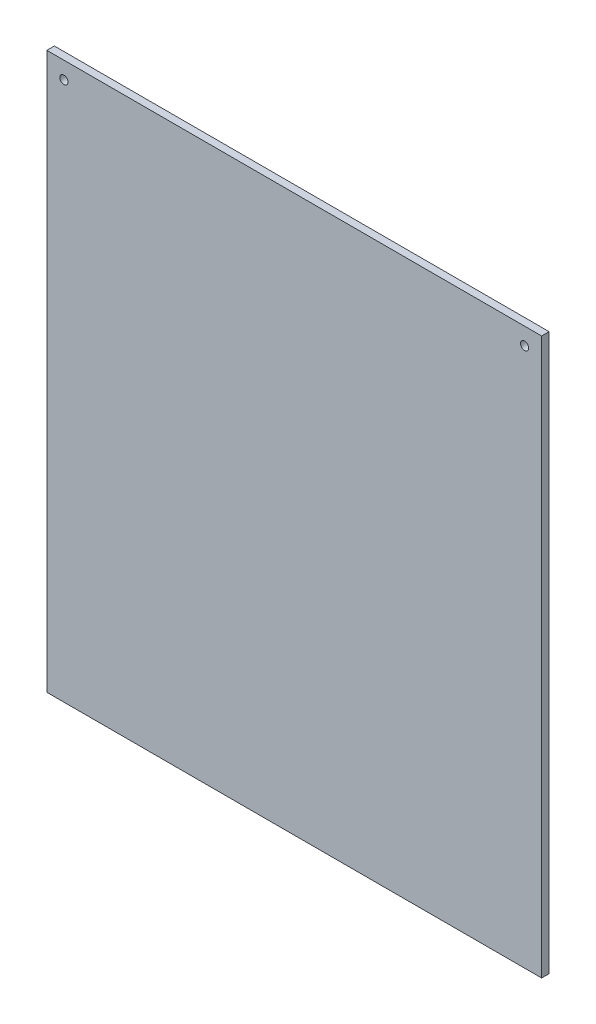
ISO-10303-21;
HEADER;
FILE_DESCRIPTION(('STEP AP214'),'2;1');
FILE_NAME('part.step','',(''),(''),'','','');
FILE_SCHEMA(('AUTOMOTIVE_DESIGN { 1 0 10303 214 1 1 1 1 }'));
ENDSEC;
DATA;
#1=APPLICATION_CONTEXT('core data for automotive mechanical design processes');
#2=APPLICATION_PROTOCOL_DEFINITION('international standard','automotive_design',2000,#1);
#3=PRODUCT_CONTEXT('',#1,'mechanical');
#4=PRODUCT('Part','Part','',(#3));
#5=PRODUCT_RELATED_PRODUCT_CATEGORY('part','',(#4));
#6=PRODUCT_DEFINITION_FORMATION('','',#4);
#7=PRODUCT_DEFINITION_CONTEXT('part definition',#1,'design');
#8=PRODUCT_DEFINITION('design','',#6,#7);
#9=PRODUCT_DEFINITION_SHAPE('','',#8);
#10=(LENGTH_UNIT() NAMED_UNIT(*) SI_UNIT(.MILLI.,.METRE.));
#11=(NAMED_UNIT(*) PLANE_ANGLE_UNIT() SI_UNIT($,.RADIAN.));
#12=(NAMED_UNIT(*) SI_UNIT($,.STERADIAN.) SOLID_ANGLE_UNIT());
#13=UNCERTAINTY_MEASURE_WITH_UNIT(LENGTH_MEASURE(1.E-05),#10,'distance_accuracy_value','');
#14=(GEOMETRIC_REPRESENTATION_CONTEXT(3) GLOBAL_UNCERTAINTY_ASSIGNED_CONTEXT((#13)) GLOBAL_UNIT_ASSIGNED_CONTEXT((#10,
#11,#12)) REPRESENTATION_CONTEXT('',''));
#15=CARTESIAN_POINT('',(0.,0.,0.));
#16=DIRECTION('',(0.,0.,1.));
#17=DIRECTION('',(1.,0.,0.));
#18=AXIS2_PLACEMENT_3D('',#15,#16,#17);
#19=CARTESIAN_POINT('',(0.,0.,3.302));
#20=DIRECTION('',(0.,0.,1.));
#21=DIRECTION('',(1.,0.,0.));
#22=AXIS2_PLACEMENT_3D('',#19,#20,#21);
#23=PLANE('',#22);
#24=CARTESIAN_POINT('',(-128.615183246073,117.38219895288,3.302));
#25=DIRECTION('',(0.,0.,1.));
#26=DIRECTION('',(1.,0.,0.));
#27=AXIS2_PLACEMENT_3D('',#24,#25,#26);
#28=CIRCLE('',#27,1.80000000000001);
#29=CARTESIAN_POINT('',(-130.415183246073,117.38219895288,3.302));
#30=VERTEX_POINT('',#29);
#31=EDGE_CURVE('E100',#30,#30,#28,.T.);
#32=ORIENTED_EDGE('',*,*,#31,.F.);
#33=EDGE_LOOP('',(#32));
#34=FACE_BOUND('',#33,.T.);
#35=DIRECTION('',(-1.,0.,0.));
#36=VECTOR('',#35,1.);
#37=CARTESIAN_POINT('',(81.8848167539267,124.88219895288,3.302));
#38=LINE('',#37,#36);
#39=CARTESIAN_POINT('',(81.8848167539267,124.88219895288,3.302));
#40=VERTEX_POINT('',#39);
#41=CARTESIAN_POINT('',(-136.115183246073,124.88219895288,3.302));
#42=VERTEX_POINT('',#41);
#43=EDGE_CURVE('E85',#40,#42,#38,.T.);
#44=ORIENTED_EDGE('',*,*,#43,.T.);
#45=DIRECTION('',(0.,-1.,0.));
#46=VECTOR('',#45,1.);
#47=CARTESIAN_POINT('',(-136.115183246073,124.88219895288,3.302));
#48=LINE('',#47,#46);
#49=CARTESIAN_POINT('',(-136.115183246073,-120.11780104712,3.302));
#50=VERTEX_POINT('',#49);
#51=EDGE_CURVE('E80',#42,#50,#48,.T.);
#52=ORIENTED_EDGE('',*,*,#51,.T.);
#53=DIRECTION('',(1.,0.,0.));
#54=VECTOR('',#53,1.);
#55=CARTESIAN_POINT('',(81.8848167539267,-120.11780104712,3.302));
#56=LINE('',#55,#54);
#57=CARTESIAN_POINT('',(81.8848167539267,-120.11780104712,3.302));
#58=VERTEX_POINT('',#57);
#59=EDGE_CURVE('E83',#50,#58,#56,.T.);
#60=ORIENTED_EDGE('',*,*,#59,.T.);
#61=DIRECTION('',(0.,1.,0.));
#62=VECTOR('',#61,1.);
#63=CARTESIAN_POINT('',(81.8848167539267,124.88219895288,3.302));
#64=LINE('',#63,#62);
#65=EDGE_CURVE('E50',#58,#40,#64,.T.);
#66=ORIENTED_EDGE('',*,*,#65,.T.);
#67=EDGE_LOOP('',(#44,#52,#60,#66));
#68=FACE_BOUND('',#67,.T.);
#69=CARTESIAN_POINT('',(74.3848167539267,117.38219895288,3.302));
#70=DIRECTION('',(0.,0.,1.));
#71=DIRECTION('',(1.,0.,0.));
#72=AXIS2_PLACEMENT_3D('',#69,#70,#71);
#73=CIRCLE('',#72,1.79999999999999);
#74=CARTESIAN_POINT('',(72.5848167539267,117.38219895288,3.302));
#75=VERTEX_POINT('',#74);
#76=EDGE_CURVE('E115',#75,#75,#73,.T.);
#77=ORIENTED_EDGE('',*,*,#76,.F.);
#78=EDGE_LOOP('',(#77));
#79=FACE_BOUND('',#78,.T.);
#80=ADVANCED_FACE('F33',(#34,#68,#79),#23,.T.);
#81=CARTESIAN_POINT('',(0.,0.,0.));
#82=DIRECTION('',(0.,0.,1.));
#83=DIRECTION('',(1.,0.,0.));
#84=AXIS2_PLACEMENT_3D('',#81,#82,#83);
#85=PLANE('',#84);
#86=DIRECTION('',(-1.,0.,0.));
#87=VECTOR('',#86,1.);
#88=CARTESIAN_POINT('',(81.8848167539267,124.88219895288,0.));
#89=LINE('',#88,#87);
#90=CARTESIAN_POINT('',(81.8848167539267,124.88219895288,0.));
#91=VERTEX_POINT('',#90);
#92=CARTESIAN_POINT('',(-136.115183246073,124.88219895288,0.));
#93=VERTEX_POINT('',#92);
#94=EDGE_CURVE('E97',#91,#93,#89,.T.);
#95=ORIENTED_EDGE('',*,*,#94,.F.);
#96=DIRECTION('',(0.,1.,0.));
#97=VECTOR('',#96,1.);
#98=CARTESIAN_POINT('',(81.8848167539267,124.88219895288,0.));
#99=LINE('',#98,#97);
#100=CARTESIAN_POINT('',(81.8848167539267,-120.11780104712,0.));
#101=VERTEX_POINT('',#100);
#102=EDGE_CURVE('E73',#101,#91,#99,.T.);
#103=ORIENTED_EDGE('',*,*,#102,.F.);
#104=DIRECTION('',(1.,0.,0.));
#105=VECTOR('',#104,1.);
#106=CARTESIAN_POINT('',(81.8848167539267,-120.11780104712,0.));
#107=LINE('',#106,#105);
#108=CARTESIAN_POINT('',(-136.115183246073,-120.11780104712,0.));
#109=VERTEX_POINT('',#108);
#110=EDGE_CURVE('E67',#109,#101,#107,.T.);
#111=ORIENTED_EDGE('',*,*,#110,.F.);
#112=DIRECTION('',(0.,-1.,0.));
#113=VECTOR('',#112,1.);
#114=CARTESIAN_POINT('',(-136.115183246073,124.88219895288,0.));
#115=LINE('',#114,#113);
#116=EDGE_CURVE('E89',#93,#109,#115,.T.);
#117=ORIENTED_EDGE('',*,*,#116,.F.);
#118=EDGE_LOOP('',(#95,#103,#111,#117));
#119=FACE_BOUND('',#118,.T.);
#120=CARTESIAN_POINT('',(-128.615183246073,117.38219895288,0.));
#121=DIRECTION('',(0.,0.,1.));
#122=DIRECTION('',(1.,0.,0.));
#123=AXIS2_PLACEMENT_3D('',#120,#121,#122);
#124=CIRCLE('',#123,1.80000000000001);
#125=CARTESIAN_POINT('',(-130.415183246073,117.38219895288,0.));
#126=VERTEX_POINT('',#125);
#127=EDGE_CURVE('E112',#126,#126,#124,.T.);
#128=ORIENTED_EDGE('',*,*,#127,.T.);
#129=EDGE_LOOP('',(#128));
#130=FACE_BOUND('',#129,.T.);
#131=CARTESIAN_POINT('',(74.3848167539267,117.38219895288,0.));
#132=DIRECTION('',(0.,0.,1.));
#133=DIRECTION('',(1.,0.,0.));
#134=AXIS2_PLACEMENT_3D('',#131,#132,#133);
#135=CIRCLE('',#134,1.79999999999999);
#136=CARTESIAN_POINT('',(72.5848167539267,117.38219895288,0.));
#137=VERTEX_POINT('',#136);
#138=EDGE_CURVE('E118',#137,#137,#135,.T.);
#139=ORIENTED_EDGE('',*,*,#138,.T.);
#140=EDGE_LOOP('',(#139));
#141=FACE_BOUND('',#140,.T.);
#142=ADVANCED_FACE('F108',(#119,#130,#141),#85,.F.);
#143=CARTESIAN_POINT('',(81.8848167539267,124.88219895288,3.302));
#144=DIRECTION('',(0.,-1.,0.));
#145=DIRECTION('',(1.,0.,0.));
#146=AXIS2_PLACEMENT_3D('',#143,#144,#145);
#147=PLANE('',#146);
#148=ORIENTED_EDGE('',*,*,#94,.T.);
#149=DIRECTION('',(0.,0.,-1.));
#150=VECTOR('',#149,1.);
#151=CARTESIAN_POINT('',(-136.115183246073,124.88219895288,3.302));
#152=LINE('',#151,#150);
#153=EDGE_CURVE('E11',#42,#93,#152,.T.);
#154=ORIENTED_EDGE('',*,*,#153,.F.);
#155=ORIENTED_EDGE('',*,*,#43,.F.);
#156=DIRECTION('',(0.,0.,-1.));
#157=VECTOR('',#156,1.);
#158=CARTESIAN_POINT('',(81.8848167539267,124.88219895288,3.302));
#159=LINE('',#158,#157);
#160=EDGE_CURVE('E93',#40,#91,#159,.T.);
#161=ORIENTED_EDGE('',*,*,#160,.T.);
#162=EDGE_LOOP('',(#148,#154,#155,#161));
#163=FACE_BOUND('',#162,.T.);
#164=ADVANCED_FACE('F35',(#163),#147,.F.);
#165=CARTESIAN_POINT('',(-136.115183246073,124.88219895288,3.302));
#166=DIRECTION('',(1.,0.,0.));
#167=DIRECTION('',(0.,1.,0.));
#168=AXIS2_PLACEMENT_3D('',#165,#166,#167);
#169=PLANE('',#168);
#170=ORIENTED_EDGE('',*,*,#116,.T.);
#171=DIRECTION('',(0.,0.,-1.));
#172=VECTOR('',#171,1.);
#173=CARTESIAN_POINT('',(-136.115183246073,-120.11780104712,3.302));
#174=LINE('',#173,#172);
#175=EDGE_CURVE('E42',#50,#109,#174,.T.);
#176=ORIENTED_EDGE('',*,*,#175,.F.);
#177=ORIENTED_EDGE('',*,*,#51,.F.);
#178=ORIENTED_EDGE('',*,*,#153,.T.);
#179=EDGE_LOOP('',(#170,#176,#177,#178));
#180=FACE_BOUND('',#179,.T.);
#181=ADVANCED_FACE('F88',(#180),#169,.F.);
#182=CARTESIAN_POINT('',(81.8848167539267,-120.11780104712,3.302));
#183=DIRECTION('',(0.,1.,0.));
#184=DIRECTION('',(-1.,0.,0.));
#185=AXIS2_PLACEMENT_3D('',#182,#183,#184);
#186=PLANE('',#185);
#187=ORIENTED_EDGE('',*,*,#110,.T.);
#188=DIRECTION('',(0.,0.,-1.));
#189=VECTOR('',#188,1.);
#190=CARTESIAN_POINT('',(81.8848167539267,-120.11780104712,3.302));
#191=LINE('',#190,#189);
#192=EDGE_CURVE('E90',#58,#101,#191,.T.);
#193=ORIENTED_EDGE('',*,*,#192,.F.);
#194=ORIENTED_EDGE('',*,*,#59,.F.);
#195=ORIENTED_EDGE('',*,*,#175,.T.);
#196=EDGE_LOOP('',(#187,#193,#194,#195));
#197=FACE_BOUND('',#196,.T.);
#198=ADVANCED_FACE('F91',(#197),#186,.F.);
#199=CARTESIAN_POINT('',(81.8848167539267,124.88219895288,3.302));
#200=DIRECTION('',(-1.,0.,0.));
#201=DIRECTION('',(0.,-1.,0.));
#202=AXIS2_PLACEMENT_3D('',#199,#200,#201);
#203=PLANE('',#202);
#204=ORIENTED_EDGE('',*,*,#102,.T.);
#205=ORIENTED_EDGE('',*,*,#160,.F.);
#206=ORIENTED_EDGE('',*,*,#65,.F.);
#207=ORIENTED_EDGE('',*,*,#192,.T.);
#208=EDGE_LOOP('',(#204,#205,#206,#207));
#209=FACE_BOUND('',#208,.T.);
#210=ADVANCED_FACE('F105',(#209),#203,.F.);
#211=CARTESIAN_POINT('',(-128.615183246073,117.38219895288,3.302));
#212=DIRECTION('',(0.,0.,-1.));
#213=DIRECTION('',(-1.,0.,0.));
#214=AXIS2_PLACEMENT_3D('',#211,#212,#213);
#215=CYLINDRICAL_SURFACE('',#214,1.80000000000001);
#216=CARTESIAN_POINT('',(-130.415183246073,117.38219895288,3.302));
#217=CARTESIAN_POINT('',(-130.415183246073,117.38219895288,3.26760416666667));
#218=CARTESIAN_POINT('',(-130.415183246073,117.38219895288,3.23320833333333));
#219=CARTESIAN_POINT('',(-130.415183246073,117.38219895288,3.16441666666667));
#220=CARTESIAN_POINT('',(-130.415183246073,117.38219895288,3.13002083333333));
#221=CARTESIAN_POINT('',(-130.415183246073,117.38219895288,3.06122916666667));
#222=CARTESIAN_POINT('',(-130.415183246073,117.38219895288,3.02683333333333));
#223=CARTESIAN_POINT('',(-130.415183246073,117.38219895288,2.95804166666667));
#224=CARTESIAN_POINT('',(-130.415183246073,117.38219895288,2.92364583333333));
#225=CARTESIAN_POINT('',(-130.415183246073,117.38219895288,2.85485416666667));
#226=CARTESIAN_POINT('',(-130.415183246073,117.38219895288,2.82045833333333));
#227=CARTESIAN_POINT('',(-130.415183246073,117.38219895288,2.75166666666667));
#228=CARTESIAN_POINT('',(-130.415183246073,117.38219895288,2.71727083333333));
#229=CARTESIAN_POINT('',(-130.415183246073,117.38219895288,2.64847916666667));
#230=CARTESIAN_POINT('',(-130.415183246073,117.38219895288,2.61408333333333));
#231=CARTESIAN_POINT('',(-130.415183246073,117.38219895288,2.54529166666667));
#232=CARTESIAN_POINT('',(-130.415183246073,117.38219895288,2.51089583333333));
#233=CARTESIAN_POINT('',(-130.415183246073,117.38219895288,2.44210416666667));
#234=CARTESIAN_POINT('',(-130.415183246073,117.38219895288,2.40770833333333));
#235=CARTESIAN_POINT('',(-130.415183246073,117.38219895288,2.33891666666667));
#236=CARTESIAN_POINT('',(-130.415183246073,117.38219895288,2.30452083333333));
#237=CARTESIAN_POINT('',(-130.415183246073,117.38219895288,2.23572916666667));
#238=CARTESIAN_POINT('',(-130.415183246073,117.38219895288,2.20133333333333));
#239=CARTESIAN_POINT('',(-130.415183246073,117.38219895288,2.13254166666667));
#240=CARTESIAN_POINT('',(-130.415183246073,117.38219895288,2.09814583333333));
#241=CARTESIAN_POINT('',(-130.415183246073,117.38219895288,2.02935416666667));
#242=CARTESIAN_POINT('',(-130.415183246073,117.38219895288,1.99495833333333));
#243=CARTESIAN_POINT('',(-130.415183246073,117.38219895288,1.92616666666667));
#244=CARTESIAN_POINT('',(-130.415183246073,117.38219895288,1.89177083333333));
#245=CARTESIAN_POINT('',(-130.415183246073,117.38219895288,1.82297916666667));
#246=CARTESIAN_POINT('',(-130.415183246073,117.38219895288,1.78858333333333));
#247=CARTESIAN_POINT('',(-130.415183246073,117.38219895288,1.71979166666667));
#248=CARTESIAN_POINT('',(-130.415183246073,117.38219895288,1.68539583333333));
#249=CARTESIAN_POINT('',(-130.415183246073,117.38219895288,1.61660416666667));
#250=CARTESIAN_POINT('',(-130.415183246073,117.38219895288,1.58220833333333));
#251=CARTESIAN_POINT('',(-130.415183246073,117.38219895288,1.51341666666667));
#252=CARTESIAN_POINT('',(-130.415183246073,117.38219895288,1.47902083333333));
#253=CARTESIAN_POINT('',(-130.415183246073,117.38219895288,1.41022916666667));
#254=CARTESIAN_POINT('',(-130.415183246073,117.38219895288,1.37583333333333));
#255=CARTESIAN_POINT('',(-130.415183246073,117.38219895288,1.30704166666667));
#256=CARTESIAN_POINT('',(-130.415183246073,117.38219895288,1.27264583333333));
#257=CARTESIAN_POINT('',(-130.415183246073,117.38219895288,1.20385416666667));
#258=CARTESIAN_POINT('',(-130.415183246073,117.38219895288,1.16945833333333));
#259=CARTESIAN_POINT('',(-130.415183246073,117.38219895288,1.10066666666667));
#260=CARTESIAN_POINT('',(-130.415183246073,117.38219895288,1.06627083333333));
#261=CARTESIAN_POINT('',(-130.415183246073,117.38219895288,0.997479166666666));
#262=CARTESIAN_POINT('',(-130.415183246073,117.38219895288,0.963083333333333));
#263=CARTESIAN_POINT('',(-130.415183246073,117.38219895288,0.894291666666666));
#264=CARTESIAN_POINT('',(-130.415183246073,117.38219895288,0.859895833333333));
#265=CARTESIAN_POINT('',(-130.415183246073,117.38219895288,0.791104166666666));
#266=CARTESIAN_POINT('',(-130.415183246073,117.38219895288,0.756708333333333));
#267=CARTESIAN_POINT('',(-130.415183246073,117.38219895288,0.687916666666667));
#268=CARTESIAN_POINT('',(-130.415183246073,117.38219895288,0.653520833333333));
#269=CARTESIAN_POINT('',(-130.415183246073,117.38219895288,0.584729166666667));
#270=CARTESIAN_POINT('',(-130.415183246073,117.38219895288,0.550333333333333));
#271=CARTESIAN_POINT('',(-130.415183246073,117.38219895288,0.481541666666667));
#272=CARTESIAN_POINT('',(-130.415183246073,117.38219895288,0.447145833333333));
#273=CARTESIAN_POINT('',(-130.415183246073,117.38219895288,0.378354166666667));
#274=CARTESIAN_POINT('',(-130.415183246073,117.38219895288,0.343958333333333));
#275=CARTESIAN_POINT('',(-130.415183246073,117.38219895288,0.275166666666667));
#276=CARTESIAN_POINT('',(-130.415183246073,117.38219895288,0.240770833333333));
#277=CARTESIAN_POINT('',(-130.415183246073,117.38219895288,0.171979166666667));
#278=CARTESIAN_POINT('',(-130.415183246073,117.38219895288,0.137583333333333));
#279=CARTESIAN_POINT('',(-130.415183246073,117.38219895288,0.0687916666666666));
#280=CARTESIAN_POINT('',(-130.415183246073,117.38219895288,0.0343958333333333));
#281=CARTESIAN_POINT('',(-130.415183246073,117.38219895288,0.));
#282=B_SPLINE_CURVE_WITH_KNOTS('',3,(#216,#217,#218,#219,#220,#221,#222,#223,#224,#225,#226,
#227,#228,#229,#230,#231,#232,#233,#234,#235,#236,#237,#238,#239,#240,#241,#242,#243,#244,#245,
#246,#247,#248,#249,#250,#251,#252,#253,#254,#255,#256,#257,#258,#259,#260,#261,#262,#263,#264,
#265,#266,#267,#268,#269,#270,#271,#272,#273,#274,#275,#276,#277,#278,#279,#280,#281),
.UNSPECIFIED.,.F.,.F.,(4,2,2,2,2,2,2,2,2,2,2,2,2,2,2,2,2,2,2,2,2,2,2,2,2,2,2,2,2,2,2,2,4),(0.,
0.1031875,0.206375,0.3095625,0.41275,0.5159375,0.619125,0.7223125,0.8255,0.9286875,1.031875,
1.1350625,1.23825,1.3414375,1.444625,1.5478125,1.651,1.7541875,1.857375,1.9605625,2.06375,
2.1669375,2.270125,2.3733125,2.4765,2.5796875,2.682875,2.7860625,2.88925,2.9924375,3.095625,
3.1988125,3.302),.UNSPECIFIED.);
#283=EDGE_CURVE('BSEAM135',#30,#126,#282,.T.);
#284=ORIENTED_EDGE('',*,*,#31,.T.);
#285=ORIENTED_EDGE('',*,*,#127,.F.);
#286=ORIENTED_EDGE('',*,*,#283,.T.);
#287=ORIENTED_EDGE('',*,*,#283,.F.);
#288=EDGE_LOOP('',(#284,#286,#285,#287));
#289=FACE_BOUND('',#288,.T.);
#290=ADVANCED_FACE('F135',(#289),#215,.F.);
#291=CARTESIAN_POINT('',(74.3848167539267,117.38219895288,3.302));
#292=DIRECTION('',(0.,0.,-1.));
#293=DIRECTION('',(-1.,0.,0.));
#294=AXIS2_PLACEMENT_3D('',#291,#292,#293);
#295=CYLINDRICAL_SURFACE('',#294,1.79999999999999);
#296=CARTESIAN_POINT('',(72.5848167539267,117.38219895288,3.302));
#297=CARTESIAN_POINT('',(72.5848167539267,117.38219895288,3.26760416666667));
#298=CARTESIAN_POINT('',(72.5848167539267,117.38219895288,3.23320833333333));
#299=CARTESIAN_POINT('',(72.5848167539267,117.38219895288,3.16441666666667));
#300=CARTESIAN_POINT('',(72.5848167539267,117.38219895288,3.13002083333333));
#301=CARTESIAN_POINT('',(72.5848167539267,117.38219895288,3.06122916666667));
#302=CARTESIAN_POINT('',(72.5848167539267,117.38219895288,3.02683333333333));
#303=CARTESIAN_POINT('',(72.5848167539267,117.38219895288,2.95804166666667));
#304=CARTESIAN_POINT('',(72.5848167539267,117.38219895288,2.92364583333333));
#305=CARTESIAN_POINT('',(72.5848167539267,117.38219895288,2.85485416666667));
#306=CARTESIAN_POINT('',(72.5848167539267,117.38219895288,2.82045833333333));
#307=CARTESIAN_POINT('',(72.5848167539267,117.38219895288,2.75166666666667));
#308=CARTESIAN_POINT('',(72.5848167539267,117.38219895288,2.71727083333333));
#309=CARTESIAN_POINT('',(72.5848167539267,117.38219895288,2.64847916666667));
#310=CARTESIAN_POINT('',(72.5848167539267,117.38219895288,2.61408333333333));
#311=CARTESIAN_POINT('',(72.5848167539267,117.38219895288,2.54529166666667));
#312=CARTESIAN_POINT('',(72.5848167539267,117.38219895288,2.51089583333333));
#313=CARTESIAN_POINT('',(72.5848167539267,117.38219895288,2.44210416666667));
#314=CARTESIAN_POINT('',(72.5848167539267,117.38219895288,2.40770833333333));
#315=CARTESIAN_POINT('',(72.5848167539267,117.38219895288,2.33891666666667));
#316=CARTESIAN_POINT('',(72.5848167539267,117.38219895288,2.30452083333333));
#317=CARTESIAN_POINT('',(72.5848167539267,117.38219895288,2.23572916666667));
#318=CARTESIAN_POINT('',(72.5848167539267,117.38219895288,2.20133333333333));
#319=CARTESIAN_POINT('',(72.5848167539267,117.38219895288,2.13254166666667));
#320=CARTESIAN_POINT('',(72.5848167539267,117.38219895288,2.09814583333333));
#321=CARTESIAN_POINT('',(72.5848167539267,117.38219895288,2.02935416666667));
#322=CARTESIAN_POINT('',(72.5848167539267,117.38219895288,1.99495833333333));
#323=CARTESIAN_POINT('',(72.5848167539267,117.38219895288,1.92616666666667));
#324=CARTESIAN_POINT('',(72.5848167539267,117.38219895288,1.89177083333333));
#325=CARTESIAN_POINT('',(72.5848167539267,117.38219895288,1.82297916666667));
#326=CARTESIAN_POINT('',(72.5848167539267,117.38219895288,1.78858333333333));
#327=CARTESIAN_POINT('',(72.5848167539267,117.38219895288,1.71979166666667));
#328=CARTESIAN_POINT('',(72.5848167539267,117.38219895288,1.68539583333333));
#329=CARTESIAN_POINT('',(72.5848167539267,117.38219895288,1.61660416666667));
#330=CARTESIAN_POINT('',(72.5848167539267,117.38219895288,1.58220833333333));
#331=CARTESIAN_POINT('',(72.5848167539267,117.38219895288,1.51341666666667));
#332=CARTESIAN_POINT('',(72.5848167539267,117.38219895288,1.47902083333333));
#333=CARTESIAN_POINT('',(72.5848167539267,117.38219895288,1.41022916666667));
#334=CARTESIAN_POINT('',(72.5848167539267,117.38219895288,1.37583333333333));
#335=CARTESIAN_POINT('',(72.5848167539267,117.38219895288,1.30704166666667));
#336=CARTESIAN_POINT('',(72.5848167539267,117.38219895288,1.27264583333333));
#337=CARTESIAN_POINT('',(72.5848167539267,117.38219895288,1.20385416666667));
#338=CARTESIAN_POINT('',(72.5848167539267,117.38219895288,1.16945833333333));
#339=CARTESIAN_POINT('',(72.5848167539267,117.38219895288,1.10066666666667));
#340=CARTESIAN_POINT('',(72.5848167539267,117.38219895288,1.06627083333333));
#341=CARTESIAN_POINT('',(72.5848167539267,117.38219895288,0.997479166666666));
#342=CARTESIAN_POINT('',(72.5848167539267,117.38219895288,0.963083333333333));
#343=CARTESIAN_POINT('',(72.5848167539267,117.38219895288,0.894291666666666));
#344=CARTESIAN_POINT('',(72.5848167539267,117.38219895288,0.859895833333333));
#345=CARTESIAN_POINT('',(72.5848167539267,117.38219895288,0.791104166666666));
#346=CARTESIAN_POINT('',(72.5848167539267,117.38219895288,0.756708333333333));
#347=CARTESIAN_POINT('',(72.5848167539267,117.38219895288,0.687916666666667));
#348=CARTESIAN_POINT('',(72.5848167539267,117.38219895288,0.653520833333333));
#349=CARTESIAN_POINT('',(72.5848167539267,117.38219895288,0.584729166666667));
#350=CARTESIAN_POINT('',(72.5848167539267,117.38219895288,0.550333333333333));
#351=CARTESIAN_POINT('',(72.5848167539267,117.38219895288,0.481541666666667));
#352=CARTESIAN_POINT('',(72.5848167539267,117.38219895288,0.447145833333333));
#353=CARTESIAN_POINT('',(72.5848167539267,117.38219895288,0.378354166666667));
#354=CARTESIAN_POINT('',(72.5848167539267,117.38219895288,0.343958333333333));
#355=CARTESIAN_POINT('',(72.5848167539267,117.38219895288,0.275166666666667));
#356=CARTESIAN_POINT('',(72.5848167539267,117.38219895288,0.240770833333333));
#357=CARTESIAN_POINT('',(72.5848167539267,117.38219895288,0.171979166666667));
#358=CARTESIAN_POINT('',(72.5848167539267,117.38219895288,0.137583333333333));
#359=CARTESIAN_POINT('',(72.5848167539267,117.38219895288,0.0687916666666666));
#360=CARTESIAN_POINT('',(72.5848167539267,117.38219895288,0.0343958333333333));
#361=CARTESIAN_POINT('',(72.5848167539267,117.38219895288,0.));
#362=B_SPLINE_CURVE_WITH_KNOTS('',3,(#296,#297,#298,#299,#300,#301,#302,#303,#304,#305,#306,
#307,#308,#309,#310,#311,#312,#313,#314,#315,#316,#317,#318,#319,#320,#321,#322,#323,#324,#325,
#326,#327,#328,#329,#330,#331,#332,#333,#334,#335,#336,#337,#338,#339,#340,#341,#342,#343,#344,
#345,#346,#347,#348,#349,#350,#351,#352,#353,#354,#355,#356,#357,#358,#359,#360,#361),
.UNSPECIFIED.,.F.,.F.,(4,2,2,2,2,2,2,2,2,2,2,2,2,2,2,2,2,2,2,2,2,2,2,2,2,2,2,2,2,2,2,2,4),(0.,
0.1031875,0.206375,0.3095625,0.41275,0.5159375,0.619125,0.7223125,0.8255,0.9286875,1.031875,
1.1350625,1.23825,1.3414375,1.444625,1.5478125,1.651,1.7541875,1.857375,1.9605625,2.06375,
2.1669375,2.270125,2.3733125,2.4765,2.5796875,2.682875,2.7860625,2.88925,2.9924375,3.095625,
3.1988125,3.302),.UNSPECIFIED.);
#363=EDGE_CURVE('BSEAM124',#75,#137,#362,.T.);
#364=ORIENTED_EDGE('',*,*,#76,.T.);
#365=ORIENTED_EDGE('',*,*,#138,.F.);
#366=ORIENTED_EDGE('',*,*,#363,.T.);
#367=ORIENTED_EDGE('',*,*,#363,.F.);
#368=EDGE_LOOP('',(#364,#366,#365,#367));
#369=FACE_BOUND('',#368,.T.);
#370=ADVANCED_FACE('F124',(#369),#295,.F.);
#371=CLOSED_SHELL('',(#80,#142,#164,#181,#198,#210,#290,#370));
#372=MANIFOLD_SOLID_BREP('B2',#371);
#373=ADVANCED_BREP_SHAPE_REPRESENTATION('',(#18,#372),#14);
#374=SHAPE_DEFINITION_REPRESENTATION(#9,#373);
ENDSEC;
END-ISO-10303-21;
